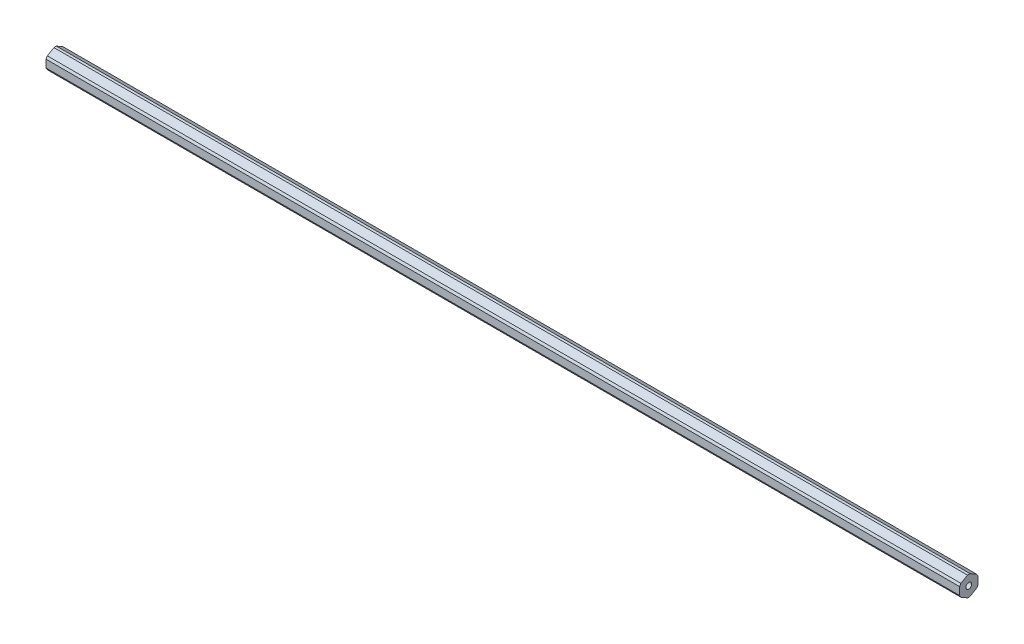
ISO-10303-21;
HEADER;
FILE_DESCRIPTION(('STEP AP214'),'2;1');
FILE_NAME('part.step','',(''),(''),'','','');
FILE_SCHEMA(('AUTOMOTIVE_DESIGN { 1 0 10303 214 1 1 1 1 }'));
ENDSEC;
DATA;
#1=APPLICATION_CONTEXT('core data for automotive mechanical design processes');
#2=APPLICATION_PROTOCOL_DEFINITION('international standard','automotive_design',2000,#1);
#3=PRODUCT_CONTEXT('',#1,'mechanical');
#4=PRODUCT('Part','Part','',(#3));
#5=PRODUCT_RELATED_PRODUCT_CATEGORY('part','',(#4));
#6=PRODUCT_DEFINITION_FORMATION('','',#4);
#7=PRODUCT_DEFINITION_CONTEXT('part definition',#1,'design');
#8=PRODUCT_DEFINITION('design','',#6,#7);
#9=PRODUCT_DEFINITION_SHAPE('','',#8);
#10=(LENGTH_UNIT() NAMED_UNIT(*) SI_UNIT(.MILLI.,.METRE.));
#11=(NAMED_UNIT(*) PLANE_ANGLE_UNIT() SI_UNIT($,.RADIAN.));
#12=(NAMED_UNIT(*) SI_UNIT($,.STERADIAN.) SOLID_ANGLE_UNIT());
#13=UNCERTAINTY_MEASURE_WITH_UNIT(LENGTH_MEASURE(1.E-05),#10,'distance_accuracy_value','');
#14=(GEOMETRIC_REPRESENTATION_CONTEXT(3) GLOBAL_UNCERTAINTY_ASSIGNED_CONTEXT((#13)) GLOBAL_UNIT_ASSIGNED_CONTEXT((#10,
#11,#12)) REPRESENTATION_CONTEXT('',''));
#15=CARTESIAN_POINT('',(0.,0.,0.));
#16=DIRECTION('',(0.,0.,1.));
#17=DIRECTION('',(1.,0.,0.));
#18=AXIS2_PLACEMENT_3D('',#15,#16,#17);
#19=CARTESIAN_POINT('',(316.,-545.131575304139,204.046477570595));
#20=DIRECTION('',(0.,-0.86602540378444,-0.5));
#21=DIRECTION('',(0.,0.5,-0.86602540378444));
#22=AXIS2_PLACEMENT_3D('',#19,#20,#21);
#23=PLANE('',#22);
#24=DIRECTION('',(-1.,0.,0.));
#25=VECTOR('',#24,1.);
#26=CARTESIAN_POINT('',(316.,-543.814744046944,201.765658928139));
#27=LINE('',#26,#25);
#28=CARTESIAN_POINT('',(316.,-543.814744046944,201.765658928139));
#29=VERTEX_POINT('',#28);
#30=CARTESIAN_POINT('',(-316.,-543.814744046944,201.76565892814));
#31=VERTEX_POINT('',#30);
#32=EDGE_CURVE('E183',#29,#31,#27,.T.);
#33=ORIENTED_EDGE('',*,*,#32,.T.);
#34=DIRECTION('',(0.,0.500000000000007,-0.866025403784435));
#35=VECTOR('',#34,1.);
#36=CARTESIAN_POINT('',(-316.,-545.131575304138,204.046477570595));
#37=LINE('',#36,#35);
#38=CARTESIAN_POINT('',(-316.,-546.448406561333,206.327296213052));
#39=VERTEX_POINT('',#38);
#40=EDGE_CURVE('E142',#39,#31,#37,.T.);
#41=ORIENTED_EDGE('',*,*,#40,.F.);
#42=DIRECTION('',(-1.,0.,0.));
#43=VECTOR('',#42,1.);
#44=CARTESIAN_POINT('',(316.,-546.448406561334,206.327296213052));
#45=LINE('',#44,#43);
#46=CARTESIAN_POINT('',(316.,-546.448406561333,206.327296213052));
#47=VERTEX_POINT('',#46);
#48=EDGE_CURVE('E186',#39,#47,#45,.F.);
#49=ORIENTED_EDGE('',*,*,#48,.T.);
#50=DIRECTION('',(0.,-0.5,0.86602540378444));
#51=VECTOR('',#50,1.);
#52=CARTESIAN_POINT('',(316.,-545.131575304139,204.046477570595));
#53=LINE('',#52,#51);
#54=EDGE_CURVE('E194',#29,#47,#53,.T.);
#55=ORIENTED_EDGE('',*,*,#54,.F.);
#56=EDGE_LOOP('',(#33,#41,#49,#55));
#57=FACE_BOUND('',#56,.T.);
#58=ADVANCED_FACE('F17',(#57),#23,.F.);
#59=CARTESIAN_POINT('',(316.,-550.631310304139,207.221751053317));
#60=DIRECTION('',(0.,0.,-1.));
#61=DIRECTION('',(-1.,0.,0.));
#62=AXIS2_PLACEMENT_3D('',#59,#60,#61);
#63=PLANE('',#62);
#64=DIRECTION('',(-1.,0.,0.));
#65=VECTOR('',#64,1.);
#66=CARTESIAN_POINT('',(316.,-547.997647789749,207.221751053317));
#67=LINE('',#66,#65);
#68=CARTESIAN_POINT('',(316.,-547.997647789749,207.221751053317));
#69=VERTEX_POINT('',#68);
#70=CARTESIAN_POINT('',(-316.,-547.997647789749,207.221751053317));
#71=VERTEX_POINT('',#70);
#72=EDGE_CURVE('E118',#69,#71,#67,.T.);
#73=ORIENTED_EDGE('',*,*,#72,.T.);
#74=DIRECTION('',(0.,1.,0.));
#75=VECTOR('',#74,1.);
#76=CARTESIAN_POINT('',(-316.,-550.631310304138,207.221751053317));
#77=LINE('',#76,#75);
#78=CARTESIAN_POINT('',(-316.,-553.264972818528,207.221751053317));
#79=VERTEX_POINT('',#78);
#80=EDGE_CURVE('E136',#79,#71,#77,.T.);
#81=ORIENTED_EDGE('',*,*,#80,.F.);
#82=DIRECTION('',(-1.,0.,0.));
#83=VECTOR('',#82,1.);
#84=CARTESIAN_POINT('',(316.,-553.264972818528,207.221751053317));
#85=LINE('',#84,#83);
#86=CARTESIAN_POINT('',(316.,-553.264972818528,207.221751053317));
#87=VERTEX_POINT('',#86);
#88=EDGE_CURVE('E179',#79,#87,#85,.F.);
#89=ORIENTED_EDGE('',*,*,#88,.T.);
#90=DIRECTION('',(0.,-1.,0.));
#91=VECTOR('',#90,1.);
#92=CARTESIAN_POINT('',(316.,-550.631310304139,207.221751053317));
#93=LINE('',#92,#91);
#94=EDGE_CURVE('E198',#69,#87,#93,.T.);
#95=ORIENTED_EDGE('',*,*,#94,.F.);
#96=EDGE_LOOP('',(#73,#81,#89,#95));
#97=FACE_BOUND('',#96,.T.);
#98=ADVANCED_FACE('F262',(#97),#63,.F.);
#99=CARTESIAN_POINT('',(316.,-556.131045304139,204.046477570595));
#100=DIRECTION('',(0.,0.866025403784439,-0.5));
#101=DIRECTION('',(0.,0.5,0.866025403784439));
#102=AXIS2_PLACEMENT_3D('',#99,#100,#101);
#103=PLANE('',#102);
#104=DIRECTION('',(-1.,0.,0.));
#105=VECTOR('',#104,1.);
#106=CARTESIAN_POINT('',(316.,-554.814214046944,206.327296213052));
#107=LINE('',#106,#105);
#108=CARTESIAN_POINT('',(316.,-554.814214046944,206.327296213052));
#109=VERTEX_POINT('',#108);
#110=CARTESIAN_POINT('',(-316.,-554.814214046944,206.327296213052));
#111=VERTEX_POINT('',#110);
#112=EDGE_CURVE('E119',#109,#111,#107,.T.);
#113=ORIENTED_EDGE('',*,*,#112,.T.);
#114=DIRECTION('',(0.,0.5,0.866025403784439));
#115=VECTOR('',#114,1.);
#116=CARTESIAN_POINT('',(-316.,-556.131045304139,204.046477570595));
#117=LINE('',#116,#115);
#118=CARTESIAN_POINT('',(-316.,-557.447876561333,201.76565892814));
#119=VERTEX_POINT('',#118);
#120=EDGE_CURVE('E125',#119,#111,#117,.T.);
#121=ORIENTED_EDGE('',*,*,#120,.F.);
#122=DIRECTION('',(-1.,0.,0.));
#123=VECTOR('',#122,1.);
#124=CARTESIAN_POINT('',(316.,-557.447876561333,201.76565892814));
#125=LINE('',#124,#123);
#126=CARTESIAN_POINT('',(316.,-557.447876561333,201.76565892814));
#127=VERTEX_POINT('',#126);
#128=EDGE_CURVE('E106',#119,#127,#125,.F.);
#129=ORIENTED_EDGE('',*,*,#128,.T.);
#130=DIRECTION('',(0.,-0.5,-0.866025403784439));
#131=VECTOR('',#130,1.);
#132=CARTESIAN_POINT('',(316.,-556.131045304139,204.046477570595));
#133=LINE('',#132,#131);
#134=EDGE_CURVE('E202',#109,#127,#133,.T.);
#135=ORIENTED_EDGE('',*,*,#134,.F.);
#136=EDGE_LOOP('',(#113,#121,#129,#135));
#137=FACE_BOUND('',#136,.T.);
#138=ADVANCED_FACE('F133',(#137),#103,.F.);
#139=CARTESIAN_POINT('',(316.,-556.131045304139,197.695930605153));
#140=DIRECTION('',(0.,0.866025403784439,0.5));
#141=DIRECTION('',(0.,-0.5,0.866025403784439));
#142=AXIS2_PLACEMENT_3D('',#139,#140,#141);
#143=PLANE('',#142);
#144=DIRECTION('',(-1.,0.,0.));
#145=VECTOR('',#144,1.);
#146=CARTESIAN_POINT('',(316.,-557.447876561333,199.976749247608));
#147=LINE('',#146,#145);
#148=CARTESIAN_POINT('',(316.,-557.447876561333,199.976749247608));
#149=VERTEX_POINT('',#148);
#150=CARTESIAN_POINT('',(-316.,-557.447876561333,199.976749247608));
#151=VERTEX_POINT('',#150);
#152=EDGE_CURVE('E168',#149,#151,#147,.T.);
#153=ORIENTED_EDGE('',*,*,#152,.T.);
#154=DIRECTION('',(0.,-0.5,0.866025403784439));
#155=VECTOR('',#154,1.);
#156=CARTESIAN_POINT('',(-316.,-556.131045304139,197.695930605153));
#157=LINE('',#156,#155);
#158=CARTESIAN_POINT('',(-316.,-554.814214046944,195.415111962696));
#159=VERTEX_POINT('',#158);
#160=EDGE_CURVE('E128',#159,#151,#157,.T.);
#161=ORIENTED_EDGE('',*,*,#160,.F.);
#162=DIRECTION('',(-1.,0.,0.));
#163=VECTOR('',#162,1.);
#164=CARTESIAN_POINT('',(316.,-554.814214046944,195.415111962696));
#165=LINE('',#164,#163);
#166=CARTESIAN_POINT('',(316.,-554.814214046944,195.415111962696));
#167=VERTEX_POINT('',#166);
#168=EDGE_CURVE('E171',#159,#167,#165,.F.);
#169=ORIENTED_EDGE('',*,*,#168,.T.);
#170=DIRECTION('',(0.,0.5,-0.866025403784439));
#171=VECTOR('',#170,1.);
#172=CARTESIAN_POINT('',(316.,-556.131045304139,197.695930605153));
#173=LINE('',#172,#171);
#174=EDGE_CURVE('E205',#149,#167,#173,.T.);
#175=ORIENTED_EDGE('',*,*,#174,.F.);
#176=EDGE_LOOP('',(#153,#161,#169,#175));
#177=FACE_BOUND('',#176,.T.);
#178=ADVANCED_FACE('F269',(#177),#143,.F.);
#179=CARTESIAN_POINT('',(316.,-550.631310304139,194.520657122431));
#180=DIRECTION('',(0.,0.,1.));
#181=DIRECTION('',(1.,0.,0.));
#182=AXIS2_PLACEMENT_3D('',#179,#180,#181);
#183=PLANE('',#182);
#184=DIRECTION('',(-1.,0.,0.));
#185=VECTOR('',#184,1.);
#186=CARTESIAN_POINT('',(316.,-553.264972818528,194.520657122431));
#187=LINE('',#186,#185);
#188=CARTESIAN_POINT('',(316.,-553.264972818528,194.520657122431));
#189=VERTEX_POINT('',#188);
#190=CARTESIAN_POINT('',(-316.,-553.264972818528,194.520657122431));
#191=VERTEX_POINT('',#190);
#192=EDGE_CURVE('E161',#189,#191,#187,.T.);
#193=ORIENTED_EDGE('',*,*,#192,.T.);
#194=DIRECTION('',(0.,-1.,0.));
#195=VECTOR('',#194,1.);
#196=CARTESIAN_POINT('',(-316.,-550.631310304138,194.520657122431));
#197=LINE('',#196,#195);
#198=CARTESIAN_POINT('',(-316.,-547.997647789749,194.520657122431));
#199=VERTEX_POINT('',#198);
#200=EDGE_CURVE('E145',#199,#191,#197,.T.);
#201=ORIENTED_EDGE('',*,*,#200,.F.);
#202=DIRECTION('',(-1.,0.,0.));
#203=VECTOR('',#202,1.);
#204=CARTESIAN_POINT('',(316.,-547.997647789749,194.520657122431));
#205=LINE('',#204,#203);
#206=CARTESIAN_POINT('',(316.,-547.997647789749,194.520657122431));
#207=VERTEX_POINT('',#206);
#208=EDGE_CURVE('E164',#199,#207,#205,.F.);
#209=ORIENTED_EDGE('',*,*,#208,.T.);
#210=DIRECTION('',(0.,1.,0.));
#211=VECTOR('',#210,1.);
#212=CARTESIAN_POINT('',(316.,-550.631310304139,194.520657122431));
#213=LINE('',#212,#211);
#214=EDGE_CURVE('E25',#189,#207,#213,.T.);
#215=ORIENTED_EDGE('',*,*,#214,.F.);
#216=EDGE_LOOP('',(#193,#201,#209,#215));
#217=FACE_BOUND('',#216,.T.);
#218=ADVANCED_FACE('F218',(#217),#183,.F.);
#219=CARTESIAN_POINT('',(316.,-545.131575304139,197.695930605153));
#220=DIRECTION('',(0.,-0.866025403784435,0.500000000000007));
#221=DIRECTION('',(0.,-0.500000000000007,-0.866025403784435));
#222=AXIS2_PLACEMENT_3D('',#219,#220,#221);
#223=PLANE('',#222);
#224=DIRECTION('',(-1.,0.,0.));
#225=VECTOR('',#224,1.);
#226=CARTESIAN_POINT('',(316.,-546.448406561333,195.415111962696));
#227=LINE('',#226,#225);
#228=CARTESIAN_POINT('',(316.,-546.448406561333,195.415111962696));
#229=VERTEX_POINT('',#228);
#230=CARTESIAN_POINT('',(-316.,-546.448406561333,195.415111962696));
#231=VERTEX_POINT('',#230);
#232=EDGE_CURVE('E40',#229,#231,#227,.T.);
#233=ORIENTED_EDGE('',*,*,#232,.T.);
#234=DIRECTION('',(0.,-0.5,-0.86602540378444));
#235=VECTOR('',#234,1.);
#236=CARTESIAN_POINT('',(-316.,-545.131575304139,197.695930605153));
#237=LINE('',#236,#235);
#238=CARTESIAN_POINT('',(-316.,-543.814744046944,199.976749247608));
#239=VERTEX_POINT('',#238);
#240=EDGE_CURVE('E228',#239,#231,#237,.T.);
#241=ORIENTED_EDGE('',*,*,#240,.F.);
#242=DIRECTION('',(-1.,0.,0.));
#243=VECTOR('',#242,1.);
#244=CARTESIAN_POINT('',(316.,-543.814744046944,199.976749247608));
#245=LINE('',#244,#243);
#246=CARTESIAN_POINT('',(316.,-543.814744046944,199.976749247608));
#247=VERTEX_POINT('',#246);
#248=EDGE_CURVE('E158',#239,#247,#245,.F.);
#249=ORIENTED_EDGE('',*,*,#248,.T.);
#250=DIRECTION('',(0.,0.500000000000007,0.866025403784435));
#251=VECTOR('',#250,1.);
#252=CARTESIAN_POINT('',(316.,-545.131575304139,197.695930605153));
#253=LINE('',#252,#251);
#254=EDGE_CURVE('E11',#229,#247,#253,.T.);
#255=ORIENTED_EDGE('',*,*,#254,.F.);
#256=EDGE_LOOP('',(#233,#241,#249,#255));
#257=FACE_BOUND('',#256,.T.);
#258=ADVANCED_FACE('F258',(#257),#223,.F.);
#259=CARTESIAN_POINT('',(316.,-550.631310304139,200.871204087874));
#260=DIRECTION('',(1.,0.,0.));
#261=DIRECTION('',(0.,1.,0.));
#262=AXIS2_PLACEMENT_3D('',#259,#260,#261);
#263=PLANE('',#262);
#264=CARTESIAN_POINT('',(316.,-550.631310304139,200.871204087874));
#265=DIRECTION('',(1.,0.,0.));
#266=DIRECTION('',(0.,1.,0.));
#267=AXIS2_PLACEMENT_3D('',#264,#265,#266);
#268=CIRCLE('',#267,2.);
#269=CARTESIAN_POINT('',(316.,-548.631310304139,200.871204087874));
#270=VERTEX_POINT('',#269);
#271=EDGE_CURVE('E190',#270,#270,#268,.T.);
#272=ORIENTED_EDGE('',*,*,#271,.F.);
#273=EDGE_LOOP('',(#272));
#274=FACE_BOUND('',#273,.T.);
#275=ORIENTED_EDGE('',*,*,#54,.T.);
#276=CARTESIAN_POINT('',(316.,-550.631310304139,200.871204087874));
#277=DIRECTION('',(1.,0.,0.));
#278=DIRECTION('',(0.,1.,0.));
#279=AXIS2_PLACEMENT_3D('',#276,#277,#278);
#280=CIRCLE('',#279,6.875);
#281=EDGE_CURVE('E155',#47,#69,#280,.T.);
#282=ORIENTED_EDGE('',*,*,#281,.T.);
#283=ORIENTED_EDGE('',*,*,#94,.T.);
#284=EDGE_CURVE('E246',#87,#109,#280,.T.);
#285=ORIENTED_EDGE('',*,*,#284,.T.);
#286=ORIENTED_EDGE('',*,*,#134,.T.);
#287=EDGE_CURVE('E112',#127,#149,#280,.T.);
#288=ORIENTED_EDGE('',*,*,#287,.T.);
#289=ORIENTED_EDGE('',*,*,#174,.T.);
#290=EDGE_CURVE('E216',#167,#189,#280,.T.);
#291=ORIENTED_EDGE('',*,*,#290,.T.);
#292=ORIENTED_EDGE('',*,*,#214,.T.);
#293=EDGE_CURVE('E154',#207,#229,#280,.T.);
#294=ORIENTED_EDGE('',*,*,#293,.T.);
#295=ORIENTED_EDGE('',*,*,#254,.T.);
#296=EDGE_CURVE('E32',#247,#29,#280,.T.);
#297=ORIENTED_EDGE('',*,*,#296,.T.);
#298=EDGE_LOOP('',(#275,#282,#283,#285,#286,#288,#289,#291,#292,#294,#295,#297));
#299=FACE_BOUND('',#298,.T.);
#300=ADVANCED_FACE('F214',(#274,#299),#263,.T.);
#301=CARTESIAN_POINT('',(316.,-550.631310304139,200.871204087874));
#302=DIRECTION('',(-1.,0.,0.));
#303=DIRECTION('',(0.,-1.,0.));
#304=AXIS2_PLACEMENT_3D('',#301,#302,#303);
#305=CYLINDRICAL_SURFACE('',#304,2.);
#306=ORIENTED_EDGE('',*,*,#271,.T.);
#307=EDGE_LOOP('',(#306));
#308=FACE_BOUND('',#307,.T.);
#309=CARTESIAN_POINT('',(-316.,-550.631310304138,200.871204087874));
#310=DIRECTION('',(-1.,0.,0.));
#311=DIRECTION('',(0.,-1.,0.));
#312=AXIS2_PLACEMENT_3D('',#309,#310,#311);
#313=CIRCLE('',#312,2.);
#314=CARTESIAN_POINT('',(-316.,-552.631310304138,200.871204087874));
#315=VERTEX_POINT('',#314);
#316=EDGE_CURVE('E235',#315,#315,#313,.T.);
#317=ORIENTED_EDGE('',*,*,#316,.T.);
#318=EDGE_LOOP('',(#317));
#319=FACE_BOUND('',#318,.T.);
#320=ADVANCED_FACE('F282',(#308,#319),#305,.F.);
#321=CARTESIAN_POINT('',(316.,-550.631310304139,200.871204087874));
#322=DIRECTION('',(-1.,0.,0.));
#323=DIRECTION('',(0.,-1.,0.));
#324=AXIS2_PLACEMENT_3D('',#321,#322,#323);
#325=CYLINDRICAL_SURFACE('',#324,6.875);
#326=ORIENTED_EDGE('',*,*,#208,.F.);
#327=CARTESIAN_POINT('',(-316.,-550.631310304138,200.871204087874));
#328=DIRECTION('',(-1.,0.,0.));
#329=DIRECTION('',(0.,-1.,0.));
#330=AXIS2_PLACEMENT_3D('',#327,#328,#329);
#331=CIRCLE('',#330,6.875);
#332=EDGE_CURVE('E224',#231,#199,#331,.T.);
#333=ORIENTED_EDGE('',*,*,#332,.F.);
#334=ORIENTED_EDGE('',*,*,#232,.F.);
#335=ORIENTED_EDGE('',*,*,#293,.F.);
#336=EDGE_LOOP('',(#326,#333,#334,#335));
#337=FACE_BOUND('',#336,.T.);
#338=ADVANCED_FACE('F223',(#337),#325,.T.);
#339=ORIENTED_EDGE('',*,*,#296,.F.);
#340=ORIENTED_EDGE('',*,*,#248,.F.);
#341=EDGE_CURVE('E230',#31,#239,#331,.T.);
#342=ORIENTED_EDGE('',*,*,#341,.F.);
#343=ORIENTED_EDGE('',*,*,#32,.F.);
#344=EDGE_LOOP('',(#339,#340,#342,#343));
#345=FACE_BOUND('',#344,.T.);
#346=ADVANCED_FACE('F256',(#345),#325,.T.);
#347=ORIENTED_EDGE('',*,*,#168,.F.);
#348=EDGE_CURVE('E130',#191,#159,#331,.T.);
#349=ORIENTED_EDGE('',*,*,#348,.F.);
#350=ORIENTED_EDGE('',*,*,#192,.F.);
#351=ORIENTED_EDGE('',*,*,#290,.F.);
#352=EDGE_LOOP('',(#347,#349,#350,#351));
#353=FACE_BOUND('',#352,.T.);
#354=ADVANCED_FACE('F271',(#353),#325,.T.);
#355=ORIENTED_EDGE('',*,*,#128,.F.);
#356=EDGE_CURVE('E109',#151,#119,#331,.T.);
#357=ORIENTED_EDGE('',*,*,#356,.F.);
#358=ORIENTED_EDGE('',*,*,#152,.F.);
#359=ORIENTED_EDGE('',*,*,#287,.F.);
#360=EDGE_LOOP('',(#355,#357,#358,#359));
#361=FACE_BOUND('',#360,.T.);
#362=ADVANCED_FACE('F108',(#361),#325,.T.);
#363=ORIENTED_EDGE('',*,*,#88,.F.);
#364=EDGE_CURVE('E132',#111,#79,#331,.T.);
#365=ORIENTED_EDGE('',*,*,#364,.F.);
#366=ORIENTED_EDGE('',*,*,#112,.F.);
#367=ORIENTED_EDGE('',*,*,#284,.F.);
#368=EDGE_LOOP('',(#363,#365,#366,#367));
#369=FACE_BOUND('',#368,.T.);
#370=ADVANCED_FACE('F264',(#369),#325,.T.);
#371=ORIENTED_EDGE('',*,*,#48,.F.);
#372=EDGE_CURVE('E232',#71,#39,#331,.T.);
#373=ORIENTED_EDGE('',*,*,#372,.F.);
#374=ORIENTED_EDGE('',*,*,#72,.F.);
#375=ORIENTED_EDGE('',*,*,#281,.F.);
#376=EDGE_LOOP('',(#371,#373,#374,#375));
#377=FACE_BOUND('',#376,.T.);
#378=ADVANCED_FACE('F278',(#377),#325,.T.);
#379=CARTESIAN_POINT('',(-316.,-550.631310304138,200.871204087874));
#380=DIRECTION('',(-1.,0.,0.));
#381=DIRECTION('',(0.,1.,0.));
#382=AXIS2_PLACEMENT_3D('',#379,#380,#381);
#383=PLANE('',#382);
#384=ORIENTED_EDGE('',*,*,#316,.F.);
#385=EDGE_LOOP('',(#384));
#386=FACE_BOUND('',#385,.T.);
#387=ORIENTED_EDGE('',*,*,#120,.T.);
#388=ORIENTED_EDGE('',*,*,#364,.T.);
#389=ORIENTED_EDGE('',*,*,#80,.T.);
#390=ORIENTED_EDGE('',*,*,#372,.T.);
#391=ORIENTED_EDGE('',*,*,#40,.T.);
#392=ORIENTED_EDGE('',*,*,#341,.T.);
#393=ORIENTED_EDGE('',*,*,#240,.T.);
#394=ORIENTED_EDGE('',*,*,#332,.T.);
#395=ORIENTED_EDGE('',*,*,#200,.T.);
#396=ORIENTED_EDGE('',*,*,#348,.T.);
#397=ORIENTED_EDGE('',*,*,#160,.T.);
#398=ORIENTED_EDGE('',*,*,#356,.T.);
#399=EDGE_LOOP('',(#387,#388,#389,#390,#391,#392,#393,#394,#395,#396,#397,#398));
#400=FACE_BOUND('',#399,.T.);
#401=ADVANCED_FACE('F123',(#386,#400),#383,.T.);
#402=CLOSED_SHELL('',(#58,#98,#138,#178,#218,#258,#300,#320,#338,#346,#354,#362,#370,#378,#401));
#403=MANIFOLD_SOLID_BREP('B1',#402);
#404=ADVANCED_BREP_SHAPE_REPRESENTATION('',(#18,#403),#14);
#405=SHAPE_DEFINITION_REPRESENTATION(#9,#404);
ENDSEC;
END-ISO-10303-21;
